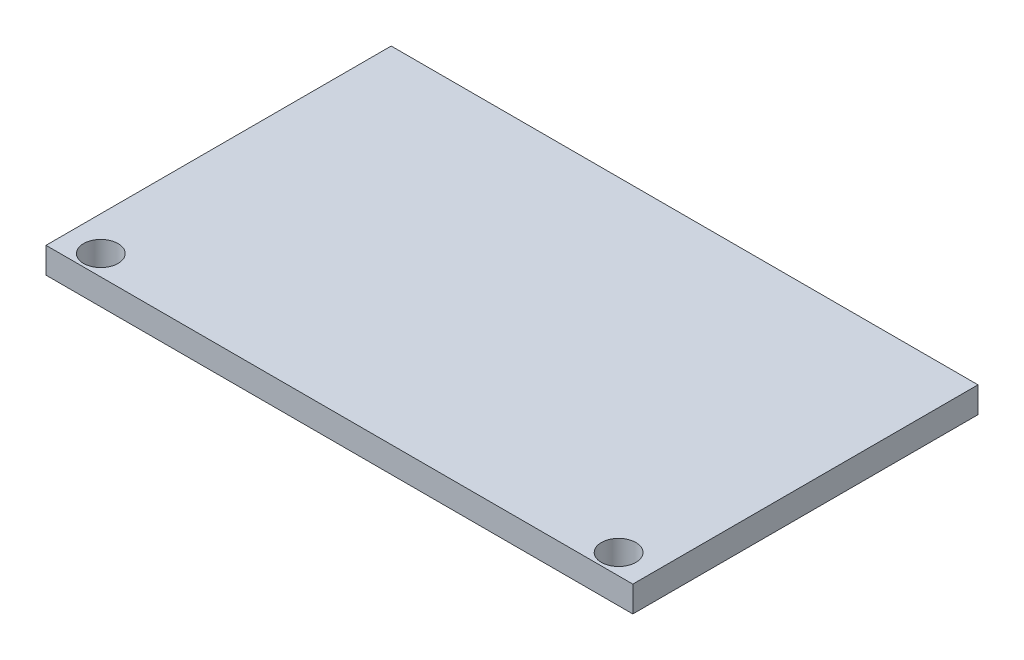
ISO-10303-21;
HEADER;
FILE_DESCRIPTION(('STEP AP214'),'2;1');
FILE_NAME('part.step','',(''),(''),'','','');
FILE_SCHEMA(('AUTOMOTIVE_DESIGN { 1 0 10303 214 1 1 1 1 }'));
ENDSEC;
DATA;
#1=APPLICATION_CONTEXT('core data for automotive mechanical design processes');
#2=APPLICATION_PROTOCOL_DEFINITION('international standard','automotive_design',2000,#1);
#3=PRODUCT_CONTEXT('',#1,'mechanical');
#4=PRODUCT('Part','Part','',(#3));
#5=PRODUCT_RELATED_PRODUCT_CATEGORY('part','',(#4));
#6=PRODUCT_DEFINITION_FORMATION('','',#4);
#7=PRODUCT_DEFINITION_CONTEXT('part definition',#1,'design');
#8=PRODUCT_DEFINITION('design','',#6,#7);
#9=PRODUCT_DEFINITION_SHAPE('','',#8);
#10=(LENGTH_UNIT() NAMED_UNIT(*) SI_UNIT(.MILLI.,.METRE.));
#11=(NAMED_UNIT(*) PLANE_ANGLE_UNIT() SI_UNIT($,.RADIAN.));
#12=(NAMED_UNIT(*) SI_UNIT($,.STERADIAN.) SOLID_ANGLE_UNIT());
#13=UNCERTAINTY_MEASURE_WITH_UNIT(LENGTH_MEASURE(1.E-05),#10,'distance_accuracy_value','');
#14=(GEOMETRIC_REPRESENTATION_CONTEXT(3) GLOBAL_UNCERTAINTY_ASSIGNED_CONTEXT((#13)) GLOBAL_UNIT_ASSIGNED_CONTEXT((#10,
#11,#12)) REPRESENTATION_CONTEXT('',''));
#15=CARTESIAN_POINT('',(0.,0.,0.));
#16=DIRECTION('',(0.,0.,1.));
#17=DIRECTION('',(1.,0.,0.));
#18=AXIS2_PLACEMENT_3D('',#15,#16,#17);
#19=CARTESIAN_POINT('',(0.,1.5,0.));
#20=DIRECTION('',(0.,1.,0.));
#21=DIRECTION('',(0.,0.,1.));
#22=AXIS2_PLACEMENT_3D('',#19,#20,#21);
#23=PLANE('',#22);
#24=CARTESIAN_POINT('',(-15.,1.5,8.8235294117647));
#25=DIRECTION('',(0.,1.,0.));
#26=DIRECTION('',(0.,0.,1.));
#27=AXIS2_PLACEMENT_3D('',#24,#25,#26);
#28=CIRCLE('',#27,0.999999999999999);
#29=CARTESIAN_POINT('',(-15.,1.5,9.8235294117647));
#30=VERTEX_POINT('',#29);
#31=EDGE_CURVE('E112',#30,#30,#28,.T.);
#32=ORIENTED_EDGE('',*,*,#31,.F.);
#33=EDGE_LOOP('',(#32));
#34=FACE_BOUND('',#33,.T.);
#35=DIRECTION('',(0.,0.,-1.));
#36=VECTOR('',#35,1.);
#37=CARTESIAN_POINT('',(17.,1.5,-10.));
#38=LINE('',#37,#36);
#39=CARTESIAN_POINT('',(17.,1.5,10.));
#40=VERTEX_POINT('',#39);
#41=CARTESIAN_POINT('',(17.,1.5,-10.));
#42=VERTEX_POINT('',#41);
#43=EDGE_CURVE('E92',#40,#42,#38,.T.);
#44=ORIENTED_EDGE('',*,*,#43,.T.);
#45=DIRECTION('',(-1.,0.,0.));
#46=VECTOR('',#45,1.);
#47=CARTESIAN_POINT('',(-17.,1.5,-10.));
#48=LINE('',#47,#46);
#49=CARTESIAN_POINT('',(-17.,1.5,-10.));
#50=VERTEX_POINT('',#49);
#51=EDGE_CURVE('E87',#42,#50,#48,.T.);
#52=ORIENTED_EDGE('',*,*,#51,.T.);
#53=DIRECTION('',(0.,0.,1.));
#54=VECTOR('',#53,1.);
#55=CARTESIAN_POINT('',(-17.,1.5,-10.));
#56=LINE('',#55,#54);
#57=CARTESIAN_POINT('',(-17.,1.5,10.));
#58=VERTEX_POINT('',#57);
#59=EDGE_CURVE('E90',#50,#58,#56,.T.);
#60=ORIENTED_EDGE('',*,*,#59,.T.);
#61=DIRECTION('',(1.,0.,0.));
#62=VECTOR('',#61,1.);
#63=CARTESIAN_POINT('',(-17.,1.5,10.));
#64=LINE('',#63,#62);
#65=EDGE_CURVE('E57',#58,#40,#64,.T.);
#66=ORIENTED_EDGE('',*,*,#65,.T.);
#67=EDGE_LOOP('',(#44,#52,#60,#66));
#68=FACE_BOUND('',#67,.T.);
#69=CARTESIAN_POINT('',(15.,1.5,8.8235294117647));
#70=DIRECTION('',(0.,1.,0.));
#71=DIRECTION('',(0.,0.,1.));
#72=AXIS2_PLACEMENT_3D('',#69,#70,#71);
#73=CIRCLE('',#72,1.00000000000001);
#74=CARTESIAN_POINT('',(15.,1.5,9.82352941176471));
#75=VERTEX_POINT('',#74);
#76=EDGE_CURVE('E134',#75,#75,#73,.T.);
#77=ORIENTED_EDGE('',*,*,#76,.F.);
#78=EDGE_LOOP('',(#77));
#79=FACE_BOUND('',#78,.T.);
#80=ADVANCED_FACE('F39',(#34,#68,#79),#23,.T.);
#81=CARTESIAN_POINT('',(0.,0.,0.));
#82=DIRECTION('',(0.,1.,0.));
#83=DIRECTION('',(0.,0.,1.));
#84=AXIS2_PLACEMENT_3D('',#81,#82,#83);
#85=PLANE('',#84);
#86=DIRECTION('',(0.,0.,-1.));
#87=VECTOR('',#86,1.);
#88=CARTESIAN_POINT('',(17.,0.,-10.));
#89=LINE('',#88,#87);
#90=CARTESIAN_POINT('',(17.,0.,10.));
#91=VERTEX_POINT('',#90);
#92=CARTESIAN_POINT('',(17.,0.,-10.));
#93=VERTEX_POINT('',#92);
#94=EDGE_CURVE('E108',#91,#93,#89,.T.);
#95=ORIENTED_EDGE('',*,*,#94,.F.);
#96=DIRECTION('',(1.,0.,0.));
#97=VECTOR('',#96,1.);
#98=CARTESIAN_POINT('',(-17.,0.,10.));
#99=LINE('',#98,#97);
#100=CARTESIAN_POINT('',(-17.,0.,10.));
#101=VERTEX_POINT('',#100);
#102=EDGE_CURVE('E80',#101,#91,#99,.T.);
#103=ORIENTED_EDGE('',*,*,#102,.F.);
#104=DIRECTION('',(0.,0.,1.));
#105=VECTOR('',#104,1.);
#106=CARTESIAN_POINT('',(-17.,0.,-10.));
#107=LINE('',#106,#105);
#108=CARTESIAN_POINT('',(-17.,0.,-10.));
#109=VERTEX_POINT('',#108);
#110=EDGE_CURVE('E74',#109,#101,#107,.T.);
#111=ORIENTED_EDGE('',*,*,#110,.F.);
#112=DIRECTION('',(-1.,0.,0.));
#113=VECTOR('',#112,1.);
#114=CARTESIAN_POINT('',(-17.,0.,-10.));
#115=LINE('',#114,#113);
#116=EDGE_CURVE('E97',#93,#109,#115,.T.);
#117=ORIENTED_EDGE('',*,*,#116,.F.);
#118=EDGE_LOOP('',(#95,#103,#111,#117));
#119=FACE_BOUND('',#118,.T.);
#120=CARTESIAN_POINT('',(-15.,0.,8.8235294117647));
#121=DIRECTION('',(0.,1.,0.));
#122=DIRECTION('',(0.,0.,1.));
#123=AXIS2_PLACEMENT_3D('',#120,#121,#122);
#124=CIRCLE('',#123,0.999999999999999);
#125=CARTESIAN_POINT('',(-15.,0.,9.8235294117647));
#126=VERTEX_POINT('',#125);
#127=EDGE_CURVE('E130',#126,#126,#124,.T.);
#128=ORIENTED_EDGE('',*,*,#127,.T.);
#129=EDGE_LOOP('',(#128));
#130=FACE_BOUND('',#129,.T.);
#131=CARTESIAN_POINT('',(15.,0.,8.8235294117647));
#132=DIRECTION('',(0.,1.,0.));
#133=DIRECTION('',(0.,0.,1.));
#134=AXIS2_PLACEMENT_3D('',#131,#132,#133);
#135=CIRCLE('',#134,1.00000000000001);
#136=CARTESIAN_POINT('',(15.,0.,9.82352941176471));
#137=VERTEX_POINT('',#136);
#138=EDGE_CURVE('E138',#137,#137,#135,.T.);
#139=ORIENTED_EDGE('',*,*,#138,.T.);
#140=EDGE_LOOP('',(#139));
#141=FACE_BOUND('',#140,.T.);
#142=ADVANCED_FACE('F125',(#119,#130,#141),#85,.F.);
#143=CARTESIAN_POINT('',(17.,1.5,-10.));
#144=DIRECTION('',(-1.,0.,0.));
#145=DIRECTION('',(0.,0.,1.));
#146=AXIS2_PLACEMENT_3D('',#143,#144,#145);
#147=PLANE('',#146);
#148=ORIENTED_EDGE('',*,*,#94,.T.);
#149=DIRECTION('',(0.,-1.,0.));
#150=VECTOR('',#149,1.);
#151=CARTESIAN_POINT('',(17.,1.5,-10.));
#152=LINE('',#151,#150);
#153=EDGE_CURVE('E11',#42,#93,#152,.T.);
#154=ORIENTED_EDGE('',*,*,#153,.F.);
#155=ORIENTED_EDGE('',*,*,#43,.F.);
#156=DIRECTION('',(0.,-1.,0.));
#157=VECTOR('',#156,1.);
#158=CARTESIAN_POINT('',(17.,1.5,10.));
#159=LINE('',#158,#157);
#160=EDGE_CURVE('E104',#40,#91,#159,.T.);
#161=ORIENTED_EDGE('',*,*,#160,.T.);
#162=EDGE_LOOP('',(#148,#154,#155,#161));
#163=FACE_BOUND('',#162,.T.);
#164=ADVANCED_FACE('F41',(#163),#147,.F.);
#165=CARTESIAN_POINT('',(-17.,1.5,-10.));
#166=DIRECTION('',(0.,0.,1.));
#167=DIRECTION('',(1.,0.,0.));
#168=AXIS2_PLACEMENT_3D('',#165,#166,#167);
#169=PLANE('',#168);
#170=ORIENTED_EDGE('',*,*,#116,.T.);
#171=DIRECTION('',(0.,-1.,0.));
#172=VECTOR('',#171,1.);
#173=CARTESIAN_POINT('',(-17.,1.5,-10.));
#174=LINE('',#173,#172);
#175=EDGE_CURVE('E49',#50,#109,#174,.T.);
#176=ORIENTED_EDGE('',*,*,#175,.F.);
#177=ORIENTED_EDGE('',*,*,#51,.F.);
#178=ORIENTED_EDGE('',*,*,#153,.T.);
#179=EDGE_LOOP('',(#170,#176,#177,#178));
#180=FACE_BOUND('',#179,.T.);
#181=ADVANCED_FACE('F96',(#180),#169,.F.);
#182=CARTESIAN_POINT('',(-17.,1.5,-10.));
#183=DIRECTION('',(1.,0.,0.));
#184=DIRECTION('',(0.,0.,-1.));
#185=AXIS2_PLACEMENT_3D('',#182,#183,#184);
#186=PLANE('',#185);
#187=ORIENTED_EDGE('',*,*,#110,.T.);
#188=DIRECTION('',(0.,-1.,0.));
#189=VECTOR('',#188,1.);
#190=CARTESIAN_POINT('',(-17.,1.5,10.));
#191=LINE('',#190,#189);
#192=EDGE_CURVE('E99',#58,#101,#191,.T.);
#193=ORIENTED_EDGE('',*,*,#192,.F.);
#194=ORIENTED_EDGE('',*,*,#59,.F.);
#195=ORIENTED_EDGE('',*,*,#175,.T.);
#196=EDGE_LOOP('',(#187,#193,#194,#195));
#197=FACE_BOUND('',#196,.T.);
#198=ADVANCED_FACE('F100',(#197),#186,.F.);
#199=CARTESIAN_POINT('',(-17.,1.5,10.));
#200=DIRECTION('',(0.,0.,-1.));
#201=DIRECTION('',(-1.,0.,0.));
#202=AXIS2_PLACEMENT_3D('',#199,#200,#201);
#203=PLANE('',#202);
#204=ORIENTED_EDGE('',*,*,#102,.T.);
#205=ORIENTED_EDGE('',*,*,#160,.F.);
#206=ORIENTED_EDGE('',*,*,#65,.F.);
#207=ORIENTED_EDGE('',*,*,#192,.T.);
#208=EDGE_LOOP('',(#204,#205,#206,#207));
#209=FACE_BOUND('',#208,.T.);
#210=ADVANCED_FACE('F122',(#209),#203,.F.);
#211=CARTESIAN_POINT('',(-15.,1.5,8.8235294117647));
#212=DIRECTION('',(0.,-1.,0.));
#213=DIRECTION('',(0.,0.,-1.));
#214=AXIS2_PLACEMENT_3D('',#211,#212,#213);
#215=CYLINDRICAL_SURFACE('',#214,0.999999999999999);
#216=ORIENTED_EDGE('',*,*,#31,.T.);
#217=EDGE_LOOP('',(#216));
#218=FACE_BOUND('',#217,.T.);
#219=ORIENTED_EDGE('',*,*,#127,.F.);
#220=EDGE_LOOP('',(#219));
#221=FACE_BOUND('',#220,.T.);
#222=ADVANCED_FACE('F157',(#218,#221),#215,.F.);
#223=CARTESIAN_POINT('',(15.,1.5,8.8235294117647));
#224=DIRECTION('',(0.,-1.,0.));
#225=DIRECTION('',(0.,0.,-1.));
#226=AXIS2_PLACEMENT_3D('',#223,#224,#225);
#227=CYLINDRICAL_SURFACE('',#226,1.00000000000001);
#228=ORIENTED_EDGE('',*,*,#76,.T.);
#229=EDGE_LOOP('',(#228));
#230=FACE_BOUND('',#229,.T.);
#231=ORIENTED_EDGE('',*,*,#138,.F.);
#232=EDGE_LOOP('',(#231));
#233=FACE_BOUND('',#232,.T.);
#234=ADVANCED_FACE('F146',(#230,#233),#227,.F.);
#235=CLOSED_SHELL('',(#80,#142,#164,#181,#198,#210,#222,#234));
#236=MANIFOLD_SOLID_BREP('B2',#235);
#237=ADVANCED_BREP_SHAPE_REPRESENTATION('',(#18,#236),#14);
#238=SHAPE_DEFINITION_REPRESENTATION(#9,#237);
ENDSEC;
END-ISO-10303-21;
